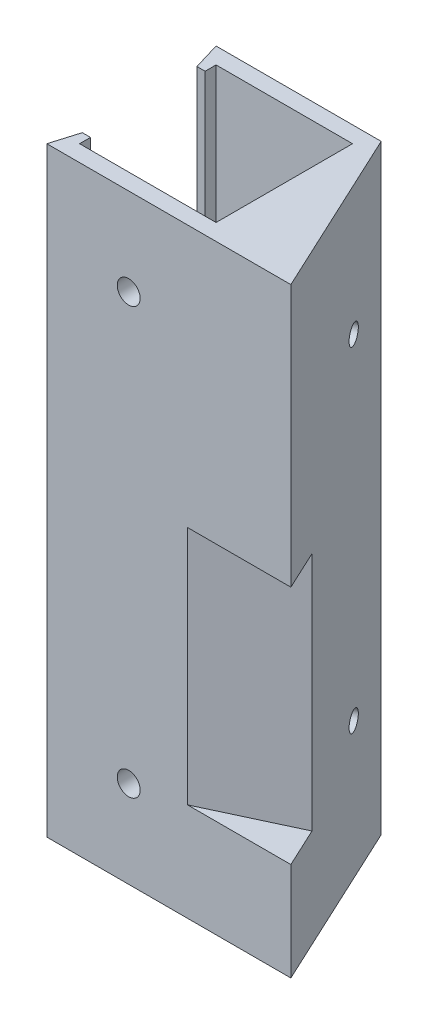
ISO-10303-21;
HEADER;
FILE_DESCRIPTION(('STEP AP214'),'2;1');
FILE_NAME('part.step','',(''),(''),'','','');
FILE_SCHEMA(('AUTOMOTIVE_DESIGN { 1 0 10303 214 1 1 1 1 }'));
ENDSEC;
DATA;
#1=APPLICATION_CONTEXT('core data for automotive mechanical design processes');
#2=APPLICATION_PROTOCOL_DEFINITION('international standard','automotive_design',2000,#1);
#3=PRODUCT_CONTEXT('',#1,'mechanical');
#4=PRODUCT('Part','Part','',(#3));
#5=PRODUCT_RELATED_PRODUCT_CATEGORY('part','',(#4));
#6=PRODUCT_DEFINITION_FORMATION('','',#4);
#7=PRODUCT_DEFINITION_CONTEXT('part definition',#1,'design');
#8=PRODUCT_DEFINITION('design','',#6,#7);
#9=PRODUCT_DEFINITION_SHAPE('','',#8);
#10=(LENGTH_UNIT() NAMED_UNIT(*) SI_UNIT(.MILLI.,.METRE.));
#11=(NAMED_UNIT(*) PLANE_ANGLE_UNIT() SI_UNIT($,.RADIAN.));
#12=(NAMED_UNIT(*) SI_UNIT($,.STERADIAN.) SOLID_ANGLE_UNIT());
#13=UNCERTAINTY_MEASURE_WITH_UNIT(LENGTH_MEASURE(1.E-05),#10,'distance_accuracy_value','');
#14=(GEOMETRIC_REPRESENTATION_CONTEXT(3) GLOBAL_UNCERTAINTY_ASSIGNED_CONTEXT((#13)) GLOBAL_UNIT_ASSIGNED_CONTEXT((#10,
#11,#12)) REPRESENTATION_CONTEXT('',''));
#15=CARTESIAN_POINT('',(0.,0.,0.));
#16=DIRECTION('',(0.,0.,1.));
#17=DIRECTION('',(1.,0.,0.));
#18=AXIS2_PLACEMENT_3D('',#15,#16,#17);
#19=CARTESIAN_POINT('',(-36.5790075050805,110.,-34.9697397940122));
#20=DIRECTION('',(0.,0.,1.));
#21=DIRECTION('',(1.,0.,0.));
#22=AXIS2_PLACEMENT_3D('',#19,#20,#21);
#23=PLANE('',#22);
#24=CARTESIAN_POINT('',(-51.8257575757576,94.,-34.9697397940122));
#25=DIRECTION('',(0.,0.,1.));
#26=DIRECTION('',(1.,0.,0.));
#27=AXIS2_PLACEMENT_3D('',#24,#25,#26);
#28=CIRCLE('',#27,2.1);
#29=CARTESIAN_POINT('',(-49.7257575757576,94.,-34.9697397940122));
#30=VERTEX_POINT('',#29);
#31=EDGE_CURVE('E470',#30,#30,#28,.T.);
#32=ORIENTED_EDGE('',*,*,#31,.T.);
#33=EDGE_LOOP('',(#32));
#34=FACE_BOUND('',#33,.T.);
#35=CARTESIAN_POINT('',(-51.8257575757576,16.,-34.9697397940122));
#36=DIRECTION('',(0.,0.,1.));
#37=DIRECTION('',(1.,0.,0.));
#38=AXIS2_PLACEMENT_3D('',#35,#36,#37);
#39=CIRCLE('',#38,2.1);
#40=CARTESIAN_POINT('',(-49.7257575757576,16.,-34.9697397940122));
#41=VERTEX_POINT('',#40);
#42=EDGE_CURVE('E474',#41,#41,#39,.T.);
#43=ORIENTED_EDGE('',*,*,#42,.T.);
#44=EDGE_LOOP('',(#43));
#45=FACE_BOUND('',#44,.T.);
#46=DIRECTION('',(-1.,0.,0.));
#47=VECTOR('',#46,1.);
#48=CARTESIAN_POINT('',(-36.5790075050805,0.,-34.9697397940122));
#49=LINE('',#48,#47);
#50=CARTESIAN_POINT('',(-36.5790075050805,0.,-34.9697397940122));
#51=VERTEX_POINT('',#50);
#52=CARTESIAN_POINT('',(-66.8257575757576,0.,-34.9697397940122));
#53=VERTEX_POINT('',#52);
#54=EDGE_CURVE('E329',#51,#53,#49,.T.);
#55=ORIENTED_EDGE('',*,*,#54,.T.);
#56=DIRECTION('',(0.,-1.,0.));
#57=VECTOR('',#56,1.);
#58=CARTESIAN_POINT('',(-66.8257575757576,110.,-34.9697397940122));
#59=LINE('',#58,#57);
#60=CARTESIAN_POINT('',(-66.8257575757576,110.,-34.9697397940122));
#61=VERTEX_POINT('',#60);
#62=EDGE_CURVE('E402',#61,#53,#59,.T.);
#63=ORIENTED_EDGE('',*,*,#62,.F.);
#64=DIRECTION('',(-1.,0.,0.));
#65=VECTOR('',#64,1.);
#66=CARTESIAN_POINT('',(-36.5790075050805,110.,-34.9697397940122));
#67=LINE('',#66,#65);
#68=CARTESIAN_POINT('',(-36.5790075050805,110.,-34.9697397940122));
#69=VERTEX_POINT('',#68);
#70=EDGE_CURVE('E330',#69,#61,#67,.T.);
#71=ORIENTED_EDGE('',*,*,#70,.F.);
#72=DIRECTION('',(0.,-1.,0.));
#73=VECTOR('',#72,1.);
#74=CARTESIAN_POINT('',(-36.5790075050805,110.,-34.9697397940122));
#75=LINE('',#74,#73);
#76=EDGE_CURVE('E353',#69,#51,#75,.T.);
#77=ORIENTED_EDGE('',*,*,#76,.T.);
#78=EDGE_LOOP('',(#55,#63,#71,#77));
#79=FACE_BOUND('',#78,.T.);
#80=ADVANCED_FACE('F35',(#34,#45,#79),#23,.F.);
#81=CARTESIAN_POINT('',(-66.8257575757576,110.,-29.9697397940122));
#82=DIRECTION('',(0.,0.,-1.));
#83=DIRECTION('',(-1.,0.,0.));
#84=AXIS2_PLACEMENT_3D('',#81,#82,#83);
#85=PLANE('',#84);
#86=DIRECTION('',(1.,0.,0.));
#87=VECTOR('',#86,1.);
#88=CARTESIAN_POINT('',(-66.8257575757576,110.,-29.9697397940122));
#89=LINE('',#88,#87);
#90=CARTESIAN_POINT('',(-65.3257575757576,110.,-29.9697397940122));
#91=VERTEX_POINT('',#90);
#92=CARTESIAN_POINT('',(-63.8257575757576,110.,-29.9697397940122));
#93=VERTEX_POINT('',#92);
#94=EDGE_CURVE('E333',#91,#93,#89,.T.);
#95=ORIENTED_EDGE('',*,*,#94,.F.);
#96=DIRECTION('',(0.,-1.,0.));
#97=VECTOR('',#96,1.);
#98=CARTESIAN_POINT('',(-65.3257575757576,110.,-29.9697397940122));
#99=LINE('',#98,#97);
#100=CARTESIAN_POINT('',(-65.3257575757576,0.,-29.9697397940122));
#101=VERTEX_POINT('',#100);
#102=EDGE_CURVE('E300',#91,#101,#99,.T.);
#103=ORIENTED_EDGE('',*,*,#102,.T.);
#104=DIRECTION('',(1.,0.,0.));
#105=VECTOR('',#104,1.);
#106=CARTESIAN_POINT('',(-66.8257575757576,0.,-29.9697397940122));
#107=LINE('',#106,#105);
#108=CARTESIAN_POINT('',(-63.8257575757576,0.,-29.9697397940122));
#109=VERTEX_POINT('',#108);
#110=EDGE_CURVE('E356',#101,#109,#107,.T.);
#111=ORIENTED_EDGE('',*,*,#110,.T.);
#112=DIRECTION('',(0.,-1.,0.));
#113=VECTOR('',#112,1.);
#114=CARTESIAN_POINT('',(-63.8257575757576,110.,-29.9697397940122));
#115=LINE('',#114,#113);
#116=EDGE_CURVE('E399',#93,#109,#115,.T.);
#117=ORIENTED_EDGE('',*,*,#116,.F.);
#118=EDGE_LOOP('',(#95,#103,#111,#117));
#119=FACE_BOUND('',#118,.T.);
#120=ADVANCED_FACE('F460',(#119),#85,.F.);
#121=CARTESIAN_POINT('',(-63.8257575757576,110.,-29.9697397940122));
#122=DIRECTION('',(-1.,0.,0.));
#123=DIRECTION('',(0.,0.,1.));
#124=AXIS2_PLACEMENT_3D('',#121,#122,#123);
#125=PLANE('',#124);
#126=DIRECTION('',(0.,0.,-1.));
#127=VECTOR('',#126,1.);
#128=CARTESIAN_POINT('',(-63.8257575757576,0.,-29.9697397940122));
#129=LINE('',#128,#127);
#130=CARTESIAN_POINT('',(-63.8257575757576,0.,-31.9697397940122));
#131=VERTEX_POINT('',#130);
#132=EDGE_CURVE('E358',#109,#131,#129,.T.);
#133=ORIENTED_EDGE('',*,*,#132,.T.);
#134=DIRECTION('',(0.,-1.,0.));
#135=VECTOR('',#134,1.);
#136=CARTESIAN_POINT('',(-63.8257575757576,110.,-31.9697397940122));
#137=LINE('',#136,#135);
#138=CARTESIAN_POINT('',(-63.8257575757576,110.,-31.9697397940122));
#139=VERTEX_POINT('',#138);
#140=EDGE_CURVE('E396',#139,#131,#137,.T.);
#141=ORIENTED_EDGE('',*,*,#140,.F.);
#142=DIRECTION('',(0.,0.,-1.));
#143=VECTOR('',#142,1.);
#144=CARTESIAN_POINT('',(-63.8257575757576,110.,-29.9697397940122));
#145=LINE('',#144,#143);
#146=EDGE_CURVE('E336',#93,#139,#145,.T.);
#147=ORIENTED_EDGE('',*,*,#146,.F.);
#148=ORIENTED_EDGE('',*,*,#116,.T.);
#149=EDGE_LOOP('',(#133,#141,#147,#148));
#150=FACE_BOUND('',#149,.T.);
#151=ADVANCED_FACE('F465',(#150),#125,.F.);
#152=CARTESIAN_POINT('',(-63.8257575757576,110.,-31.9697397940122));
#153=DIRECTION('',(0.,0.,-1.));
#154=DIRECTION('',(-1.,0.,0.));
#155=AXIS2_PLACEMENT_3D('',#152,#153,#154);
#156=PLANE('',#155);
#157=CARTESIAN_POINT('',(-51.8257575757576,94.,-31.9697397940122));
#158=DIRECTION('',(0.,0.,-1.));
#159=DIRECTION('',(-1.,0.,0.));
#160=AXIS2_PLACEMENT_3D('',#157,#158,#159);
#161=CIRCLE('',#160,2.1);
#162=CARTESIAN_POINT('',(-53.9257575757576,94.,-31.9697397940122));
#163=VERTEX_POINT('',#162);
#164=EDGE_CURVE('E241',#163,#163,#161,.T.);
#165=ORIENTED_EDGE('',*,*,#164,.T.);
#166=EDGE_LOOP('',(#165));
#167=FACE_BOUND('',#166,.T.);
#168=CARTESIAN_POINT('',(-51.8257575757576,16.,-31.9697397940122));
#169=DIRECTION('',(0.,0.,-1.));
#170=DIRECTION('',(-1.,0.,0.));
#171=AXIS2_PLACEMENT_3D('',#168,#169,#170);
#172=CIRCLE('',#171,2.1);
#173=CARTESIAN_POINT('',(-53.9257575757576,16.,-31.9697397940122));
#174=VERTEX_POINT('',#173);
#175=EDGE_CURVE('E647',#174,#174,#172,.T.);
#176=ORIENTED_EDGE('',*,*,#175,.T.);
#177=EDGE_LOOP('',(#176));
#178=FACE_BOUND('',#177,.T.);
#179=DIRECTION('',(1.,0.,0.));
#180=VECTOR('',#179,1.);
#181=CARTESIAN_POINT('',(-63.8257575757576,0.,-31.9697397940122));
#182=LINE('',#181,#180);
#183=CARTESIAN_POINT('',(-38.8257575757576,0.,-31.9697397940122));
#184=VERTEX_POINT('',#183);
#185=EDGE_CURVE('E360',#131,#184,#182,.T.);
#186=ORIENTED_EDGE('',*,*,#185,.T.);
#187=DIRECTION('',(0.,-1.,0.));
#188=VECTOR('',#187,1.);
#189=CARTESIAN_POINT('',(-38.8257575757576,110.,-31.9697397940122));
#190=LINE('',#189,#188);
#191=CARTESIAN_POINT('',(-38.8257575757576,110.,-31.9697397940122));
#192=VERTEX_POINT('',#191);
#193=EDGE_CURVE('E393',#192,#184,#190,.T.);
#194=ORIENTED_EDGE('',*,*,#193,.F.);
#195=DIRECTION('',(1.,0.,0.));
#196=VECTOR('',#195,1.);
#197=CARTESIAN_POINT('',(-63.8257575757576,110.,-31.9697397940122));
#198=LINE('',#197,#196);
#199=EDGE_CURVE('E338',#139,#192,#198,.T.);
#200=ORIENTED_EDGE('',*,*,#199,.F.);
#201=ORIENTED_EDGE('',*,*,#140,.T.);
#202=EDGE_LOOP('',(#186,#194,#200,#201));
#203=FACE_BOUND('',#202,.T.);
#204=ADVANCED_FACE('F529',(#167,#178,#203),#156,.F.);
#205=CARTESIAN_POINT('',(-38.8257575757576,110.,-31.9697397940122));
#206=DIRECTION('',(1.,0.,0.));
#207=DIRECTION('',(0.,0.,-1.));
#208=AXIS2_PLACEMENT_3D('',#205,#206,#207);
#209=PLANE('',#208);
#210=DIRECTION('',(0.,0.,-1.));
#211=VECTOR('',#210,1.);
#212=CARTESIAN_POINT('',(-38.8257575757576,82.8,-31.9697397940122));
#213=LINE('',#212,#211);
#214=CARTESIAN_POINT('',(-38.8257575757576,82.8,-20.2121053228705));
#215=VERTEX_POINT('',#214);
#216=CARTESIAN_POINT('',(-38.8257575757576,82.8,-24.6713540925867));
#217=VERTEX_POINT('',#216);
#218=EDGE_CURVE('E42',#215,#217,#213,.T.);
#219=ORIENTED_EDGE('',*,*,#218,.T.);
#220=DIRECTION('',(0.,0.84340471613653,-0.53727877754352));
#221=VECTOR('',#220,1.);
#222=CARTESIAN_POINT('',(-38.8257575757576,105.455432925123,-39.1036700066929));
#223=LINE('',#222,#221);
#224=CARTESIAN_POINT('',(-38.8257575757576,86.3,-26.9009784774448));
#225=VERTEX_POINT('',#224);
#226=EDGE_CURVE('E11',#217,#225,#223,.T.);
#227=ORIENTED_EDGE('',*,*,#226,.T.);
#228=DIRECTION('',(0.,0.84340471613653,0.53727877754352));
#229=VECTOR('',#228,1.);
#230=CARTESIAN_POINT('',(-38.8257575757576,100.86168089542,-17.6246702463159));
#231=LINE('',#230,#229);
#232=CARTESIAN_POINT('',(-38.8257575757576,89.8,-24.6713540925867));
#233=VERTEX_POINT('',#232);
#234=EDGE_CURVE('E216',#225,#233,#231,.T.);
#235=ORIENTED_EDGE('',*,*,#234,.T.);
#236=DIRECTION('',(0.,0.,1.));
#237=VECTOR('',#236,1.);
#238=CARTESIAN_POINT('',(-38.8257575757576,89.8,-31.9697397940122));
#239=LINE('',#238,#237);
#240=CARTESIAN_POINT('',(-38.8257575757576,89.8,-20.2121053228706));
#241=VERTEX_POINT('',#240);
#242=EDGE_CURVE('E427',#233,#241,#239,.T.);
#243=ORIENTED_EDGE('',*,*,#242,.T.);
#244=DIRECTION('',(0.,-0.84340471613653,0.53727877754352));
#245=VECTOR('',#244,1.);
#246=CARTESIAN_POINT('',(-38.8257575757576,109.496791712304,-32.759661638649));
#247=LINE('',#246,#245);
#248=CARTESIAN_POINT('',(-38.8257575757576,86.3,-17.9824809380125));
#249=VERTEX_POINT('',#248);
#250=EDGE_CURVE('E430',#241,#249,#247,.T.);
#251=ORIENTED_EDGE('',*,*,#250,.T.);
#252=DIRECTION('',(0.,-0.843404716136531,-0.537278777543519));
#253=VECTOR('',#252,1.);
#254=CARTESIAN_POINT('',(-38.8257575757576,96.8203221082391,-11.280661878272));
#255=LINE('',#254,#253);
#256=EDGE_CURVE('E433',#249,#215,#255,.T.);
#257=ORIENTED_EDGE('',*,*,#256,.T.);
#258=EDGE_LOOP('',(#219,#227,#235,#243,#251,#257));
#259=FACE_BOUND('',#258,.T.);
#260=DIRECTION('',(0.,0.,-1.));
#261=VECTOR('',#260,1.);
#262=CARTESIAN_POINT('',(-38.8257575757576,21.5000000000001,-31.9697397940131));
#263=LINE('',#262,#261);
#264=CARTESIAN_POINT('',(-38.8257575757576,21.5,-20.2121053228706));
#265=VERTEX_POINT('',#264);
#266=CARTESIAN_POINT('',(-38.8257575757576,21.5,-24.6713540925868));
#267=VERTEX_POINT('',#266);
#268=EDGE_CURVE('E420',#265,#267,#263,.T.);
#269=ORIENTED_EDGE('',*,*,#268,.T.);
#270=DIRECTION('',(0.,0.843404716136534,-0.537278777543514));
#271=VECTOR('',#270,1.);
#272=CARTESIAN_POINT('',(-38.8257575757576,87.7600548069659,-66.8813637896274));
#273=LINE('',#272,#271);
#274=CARTESIAN_POINT('',(-38.8257575757576,25.,-26.9009784774448));
#275=VERTEX_POINT('',#274);
#276=EDGE_CURVE('E423',#267,#275,#273,.T.);
#277=ORIENTED_EDGE('',*,*,#276,.T.);
#278=DIRECTION('',(0.,0.84340471613653,0.53727877754352));
#279=VECTOR('',#278,1.);
#280=CARTESIAN_POINT('',(-38.8257575757576,83.1663027772625,10.1530235366189));
#281=LINE('',#280,#279);
#282=CARTESIAN_POINT('',(-38.8257575757576,28.5,-24.6713540925867));
#283=VERTEX_POINT('',#282);
#284=EDGE_CURVE('E404',#275,#283,#281,.T.);
#285=ORIENTED_EDGE('',*,*,#284,.T.);
#286=DIRECTION('',(0.,0.,1.));
#287=VECTOR('',#286,1.);
#288=CARTESIAN_POINT('',(-38.8257575757576,28.5,-31.9697397940124));
#289=LINE('',#288,#287);
#290=CARTESIAN_POINT('',(-38.8257575757576,28.5,-20.2121053228705));
#291=VERTEX_POINT('',#290);
#292=EDGE_CURVE('E411',#283,#291,#289,.T.);
#293=ORIENTED_EDGE('',*,*,#292,.T.);
#294=DIRECTION('',(0.,-0.843404716136533,0.537278777543514));
#295=VECTOR('',#294,1.);
#296=CARTESIAN_POINT('',(-38.8257575757576,91.8014135941471,-60.5373554215836));
#297=LINE('',#296,#295);
#298=CARTESIAN_POINT('',(-38.8257575757576,25.,-17.9824809380125));
#299=VERTEX_POINT('',#298);
#300=EDGE_CURVE('E414',#291,#299,#297,.T.);
#301=ORIENTED_EDGE('',*,*,#300,.T.);
#302=DIRECTION('',(0.,-0.843404716136525,-0.537278777543528));
#303=VECTOR('',#302,1.);
#304=CARTESIAN_POINT('',(-38.8257575757576,79.1249439900805,16.497031904663));
#305=LINE('',#304,#303);
#306=EDGE_CURVE('E417',#299,#265,#305,.T.);
#307=ORIENTED_EDGE('',*,*,#306,.T.);
#308=EDGE_LOOP('',(#269,#277,#285,#293,#301,#307));
#309=FACE_BOUND('',#308,.T.);
#310=DIRECTION('',(0.,0.,1.));
#311=VECTOR('',#310,1.);
#312=CARTESIAN_POINT('',(-38.8257575757576,0.,-31.9697397940122));
#313=LINE('',#312,#311);
#314=CARTESIAN_POINT('',(-38.8257575757576,0.,-6.96973979401218));
#315=VERTEX_POINT('',#314);
#316=EDGE_CURVE('E362',#184,#315,#313,.T.);
#317=ORIENTED_EDGE('',*,*,#316,.T.);
#318=DIRECTION('',(0.,-1.,0.));
#319=VECTOR('',#318,1.);
#320=CARTESIAN_POINT('',(-38.8257575757576,110.,-6.96973979401218));
#321=LINE('',#320,#319);
#322=CARTESIAN_POINT('',(-38.8257575757576,110.,-6.96973979401218));
#323=VERTEX_POINT('',#322);
#324=EDGE_CURVE('E390',#323,#315,#321,.T.);
#325=ORIENTED_EDGE('',*,*,#324,.F.);
#326=DIRECTION('',(0.,0.,1.));
#327=VECTOR('',#326,1.);
#328=CARTESIAN_POINT('',(-38.8257575757576,110.,-31.9697397940122));
#329=LINE('',#328,#327);
#330=EDGE_CURVE('E340',#192,#323,#329,.T.);
#331=ORIENTED_EDGE('',*,*,#330,.F.);
#332=ORIENTED_EDGE('',*,*,#193,.T.);
#333=EDGE_LOOP('',(#317,#325,#331,#332));
#334=FACE_BOUND('',#333,.T.);
#335=ADVANCED_FACE('F437',(#259,#309,#334),#209,.F.);
#336=CARTESIAN_POINT('',(-38.8257575757576,110.,-6.96973979401218));
#337=DIRECTION('',(0.,0.,1.));
#338=DIRECTION('',(1.,0.,0.));
#339=AXIS2_PLACEMENT_3D('',#336,#337,#338);
#340=PLANE('',#339);
#341=CARTESIAN_POINT('',(-51.8257575757576,94.,-6.96973979401218));
#342=DIRECTION('',(0.,0.,1.));
#343=DIRECTION('',(1.,0.,0.));
#344=AXIS2_PLACEMENT_3D('',#341,#342,#343);
#345=CIRCLE('',#344,2.1);
#346=CARTESIAN_POINT('',(-49.7257575757576,94.,-6.96973979401218));
#347=VERTEX_POINT('',#346);
#348=EDGE_CURVE('E646',#347,#347,#345,.T.);
#349=ORIENTED_EDGE('',*,*,#348,.T.);
#350=EDGE_LOOP('',(#349));
#351=FACE_BOUND('',#350,.T.);
#352=CARTESIAN_POINT('',(-51.8257575757576,16.,-6.96973979401218));
#353=DIRECTION('',(0.,0.,1.));
#354=DIRECTION('',(1.,0.,0.));
#355=AXIS2_PLACEMENT_3D('',#352,#353,#354);
#356=CIRCLE('',#355,2.1);
#357=CARTESIAN_POINT('',(-49.7257575757576,16.,-6.96973979401218));
#358=VERTEX_POINT('',#357);
#359=EDGE_CURVE('E650',#358,#358,#356,.T.);
#360=ORIENTED_EDGE('',*,*,#359,.T.);
#361=EDGE_LOOP('',(#360));
#362=FACE_BOUND('',#361,.T.);
#363=DIRECTION('',(-1.,0.,0.));
#364=VECTOR('',#363,1.);
#365=CARTESIAN_POINT('',(-38.8257575757576,0.,-6.96973979401218));
#366=LINE('',#365,#364);
#367=CARTESIAN_POINT('',(-63.8257575757576,0.,-6.96973979401218));
#368=VERTEX_POINT('',#367);
#369=EDGE_CURVE('E364',#315,#368,#366,.T.);
#370=ORIENTED_EDGE('',*,*,#369,.T.);
#371=DIRECTION('',(0.,-1.,0.));
#372=VECTOR('',#371,1.);
#373=CARTESIAN_POINT('',(-63.8257575757576,110.,-6.96973979401218));
#374=LINE('',#373,#372);
#375=CARTESIAN_POINT('',(-63.8257575757576,110.,-6.96973979401218));
#376=VERTEX_POINT('',#375);
#377=EDGE_CURVE('E387',#376,#368,#374,.T.);
#378=ORIENTED_EDGE('',*,*,#377,.F.);
#379=DIRECTION('',(-1.,0.,0.));
#380=VECTOR('',#379,1.);
#381=CARTESIAN_POINT('',(-38.8257575757576,110.,-6.96973979401218));
#382=LINE('',#381,#380);
#383=EDGE_CURVE('E342',#323,#376,#382,.T.);
#384=ORIENTED_EDGE('',*,*,#383,.F.);
#385=ORIENTED_EDGE('',*,*,#324,.T.);
#386=EDGE_LOOP('',(#370,#378,#384,#385));
#387=FACE_BOUND('',#386,.T.);
#388=ADVANCED_FACE('F521',(#351,#362,#387),#340,.F.);
#389=CARTESIAN_POINT('',(-63.8257575757576,110.,-6.96973979401218));
#390=DIRECTION('',(-1.,0.,0.));
#391=DIRECTION('',(0.,0.,1.));
#392=AXIS2_PLACEMENT_3D('',#389,#390,#391);
#393=PLANE('',#392);
#394=DIRECTION('',(0.,0.,-1.));
#395=VECTOR('',#394,1.);
#396=CARTESIAN_POINT('',(-63.8257575757576,0.,-6.96973979401218));
#397=LINE('',#396,#395);
#398=CARTESIAN_POINT('',(-63.8257575757576,0.,-8.96973979401218));
#399=VERTEX_POINT('',#398);
#400=EDGE_CURVE('E366',#368,#399,#397,.T.);
#401=ORIENTED_EDGE('',*,*,#400,.T.);
#402=DIRECTION('',(0.,-1.,0.));
#403=VECTOR('',#402,1.);
#404=CARTESIAN_POINT('',(-63.8257575757576,110.,-8.96973979401218));
#405=LINE('',#404,#403);
#406=CARTESIAN_POINT('',(-63.8257575757576,110.,-8.96973979401218));
#407=VERTEX_POINT('',#406);
#408=EDGE_CURVE('E384',#407,#399,#405,.T.);
#409=ORIENTED_EDGE('',*,*,#408,.F.);
#410=DIRECTION('',(0.,0.,-1.));
#411=VECTOR('',#410,1.);
#412=CARTESIAN_POINT('',(-63.8257575757576,110.,-6.96973979401218));
#413=LINE('',#412,#411);
#414=EDGE_CURVE('E344',#376,#407,#413,.T.);
#415=ORIENTED_EDGE('',*,*,#414,.F.);
#416=ORIENTED_EDGE('',*,*,#377,.T.);
#417=EDGE_LOOP('',(#401,#409,#415,#416));
#418=FACE_BOUND('',#417,.T.);
#419=ADVANCED_FACE('F515',(#418),#393,.F.);
#420=CARTESIAN_POINT('',(-63.8257575757576,110.,-8.96973979401218));
#421=DIRECTION('',(0.,0.,1.));
#422=DIRECTION('',(1.,0.,0.));
#423=AXIS2_PLACEMENT_3D('',#420,#421,#422);
#424=PLANE('',#423);
#425=DIRECTION('',(-1.,0.,0.));
#426=VECTOR('',#425,1.);
#427=CARTESIAN_POINT('',(-63.8257575757576,0.,-8.96973979401218));
#428=LINE('',#427,#426);
#429=CARTESIAN_POINT('',(-65.3257575757576,0.,-8.96973979401218));
#430=VERTEX_POINT('',#429);
#431=EDGE_CURVE('E368',#399,#430,#428,.T.);
#432=ORIENTED_EDGE('',*,*,#431,.T.);
#433=DIRECTION('',(0.,-1.,0.));
#434=VECTOR('',#433,1.);
#435=CARTESIAN_POINT('',(-65.3257575757576,110.,-8.96973979401218));
#436=LINE('',#435,#434);
#437=CARTESIAN_POINT('',(-65.3257575757576,110.,-8.96973979401218));
#438=VERTEX_POINT('',#437);
#439=EDGE_CURVE('E297',#438,#430,#436,.T.);
#440=ORIENTED_EDGE('',*,*,#439,.F.);
#441=DIRECTION('',(-1.,0.,0.));
#442=VECTOR('',#441,1.);
#443=CARTESIAN_POINT('',(-63.8257575757576,110.,-8.96973979401218));
#444=LINE('',#443,#442);
#445=EDGE_CURVE('E346',#407,#438,#444,.T.);
#446=ORIENTED_EDGE('',*,*,#445,.F.);
#447=ORIENTED_EDGE('',*,*,#408,.T.);
#448=EDGE_LOOP('',(#432,#440,#446,#447));
#449=FACE_BOUND('',#448,.T.);
#450=ADVANCED_FACE('F510',(#449),#424,.F.);
#451=CARTESIAN_POINT('',(-66.8257575757576,110.,-3.96973979401218));
#452=DIRECTION('',(0.,0.,-1.));
#453=DIRECTION('',(-1.,0.,0.));
#454=AXIS2_PLACEMENT_3D('',#451,#452,#453);
#455=PLANE('',#454);
#456=CARTESIAN_POINT('',(-51.8257575757576,94.,-3.96973979401218));
#457=DIRECTION('',(0.,0.,1.));
#458=DIRECTION('',(1.,0.,0.));
#459=AXIS2_PLACEMENT_3D('',#456,#457,#458);
#460=CIRCLE('',#459,2.1);
#461=CARTESIAN_POINT('',(-49.7257575757576,94.,-3.96973979401218));
#462=VERTEX_POINT('',#461);
#463=EDGE_CURVE('E643',#462,#462,#460,.T.);
#464=ORIENTED_EDGE('',*,*,#463,.F.);
#465=EDGE_LOOP('',(#464));
#466=FACE_BOUND('',#465,.T.);
#467=CARTESIAN_POINT('',(-51.8257575757576,16.,-3.96973979401218));
#468=DIRECTION('',(0.,0.,1.));
#469=DIRECTION('',(1.,0.,0.));
#470=AXIS2_PLACEMENT_3D('',#467,#468,#469);
#471=CIRCLE('',#470,2.1);
#472=CARTESIAN_POINT('',(-49.7257575757576,16.,-3.96973979401218));
#473=VERTEX_POINT('',#472);
#474=EDGE_CURVE('E655',#473,#473,#471,.T.);
#475=ORIENTED_EDGE('',*,*,#474,.F.);
#476=EDGE_LOOP('',(#475));
#477=FACE_BOUND('',#476,.T.);
#478=DIRECTION('',(0.,1.,0.));
#479=VECTOR('',#478,1.);
#480=CARTESIAN_POINT('',(-41.053082767496,110.,-3.96973979401218));
#481=LINE('',#480,#479);
#482=CARTESIAN_POINT('',(-41.053082767496,18.,-3.96973979401218));
#483=VERTEX_POINT('',#482);
#484=CARTESIAN_POINT('',(-41.053082767496,62.,-3.96973979401217));
#485=VERTEX_POINT('',#484);
#486=EDGE_CURVE('E323',#483,#485,#481,.T.);
#487=ORIENTED_EDGE('',*,*,#486,.T.);
#488=DIRECTION('',(1.,0.,0.));
#489=VECTOR('',#488,1.);
#490=CARTESIAN_POINT('',(-66.8257575757576,62.,-3.96973979401218));
#491=LINE('',#490,#489);
#492=CARTESIAN_POINT('',(-22.1234701022758,62.,-3.96973979401217));
#493=VERTEX_POINT('',#492);
#494=EDGE_CURVE('E326',#485,#493,#491,.T.);
#495=ORIENTED_EDGE('',*,*,#494,.T.);
#496=DIRECTION('',(0.,-1.,0.));
#497=VECTOR('',#496,1.);
#498=CARTESIAN_POINT('',(-22.1234701022757,110.,-3.96973979401218));
#499=LINE('',#498,#497);
#500=CARTESIAN_POINT('',(-22.1234701022757,110.,-3.96973979401218));
#501=VERTEX_POINT('',#500);
#502=EDGE_CURVE('E378',#501,#493,#499,.T.);
#503=ORIENTED_EDGE('',*,*,#502,.F.);
#504=DIRECTION('',(1.,0.,0.));
#505=VECTOR('',#504,1.);
#506=CARTESIAN_POINT('',(-66.8257575757576,110.,-3.96973979401218));
#507=LINE('',#506,#505);
#508=CARTESIAN_POINT('',(-66.8257575757576,110.,-3.96973979401218));
#509=VERTEX_POINT('',#508);
#510=EDGE_CURVE('E349',#509,#501,#507,.T.);
#511=ORIENTED_EDGE('',*,*,#510,.F.);
#512=DIRECTION('',(0.,-1.,0.));
#513=VECTOR('',#512,1.);
#514=CARTESIAN_POINT('',(-66.8257575757576,110.,-3.96973979401218));
#515=LINE('',#514,#513);
#516=CARTESIAN_POINT('',(-66.8257575757576,0.,-3.96973979401218));
#517=VERTEX_POINT('',#516);
#518=EDGE_CURVE('E381',#509,#517,#515,.T.);
#519=ORIENTED_EDGE('',*,*,#518,.T.);
#520=DIRECTION('',(1.,0.,0.));
#521=VECTOR('',#520,1.);
#522=CARTESIAN_POINT('',(-66.8257575757576,0.,-3.96973979401218));
#523=LINE('',#522,#521);
#524=CARTESIAN_POINT('',(-22.1234701022757,0.,-3.96973979401218));
#525=VERTEX_POINT('',#524);
#526=EDGE_CURVE('E371',#517,#525,#523,.T.);
#527=ORIENTED_EDGE('',*,*,#526,.T.);
#528=CARTESIAN_POINT('',(-22.1234701022757,18.,-3.96973979401218));
#529=VERTEX_POINT('',#528);
#530=EDGE_CURVE('E377',#529,#525,#499,.T.);
#531=ORIENTED_EDGE('',*,*,#530,.F.);
#532=DIRECTION('',(-1.,0.,0.));
#533=VECTOR('',#532,1.);
#534=CARTESIAN_POINT('',(-66.8257575757576,18.,-3.96973979401218));
#535=LINE('',#534,#533);
#536=EDGE_CURVE('E319',#529,#483,#535,.T.);
#537=ORIENTED_EDGE('',*,*,#536,.T.);
#538=EDGE_LOOP('',(#487,#495,#503,#511,#519,#527,#531,#537));
#539=FACE_BOUND('',#538,.T.);
#540=ADVANCED_FACE('F503',(#466,#477,#539),#455,.F.);
#541=CARTESIAN_POINT('',(-22.1234701022757,110.,-3.96973979401218));
#542=DIRECTION('',(-0.906307787036652,0.,0.422618261740694));
#543=DIRECTION('',(0.422618261740694,0.,0.906307787036653));
#544=AXIS2_PLACEMENT_3D('',#541,#542,#543);
#545=PLANE('',#544);
#546=CARTESIAN_POINT('',(-32.1817847317043,86.3,-25.5398651254845));
#547=DIRECTION('',(0.906307787036653,0.,-0.422618261740694));
#548=DIRECTION('',(-0.422618261740694,0.,-0.906307787036653));
#549=AXIS2_PLACEMENT_3D('',#546,#547,#548);
#550=CIRCLE('',#549,1.75);
#551=CARTESIAN_POINT('',(-32.9213666897505,86.3,-27.1259037527986));
#552=VERTEX_POINT('',#551);
#553=EDGE_CURVE('E286',#552,#552,#550,.T.);
#554=ORIENTED_EDGE('',*,*,#553,.F.);
#555=EDGE_LOOP('',(#554));
#556=FACE_BOUND('',#555,.T.);
#557=CARTESIAN_POINT('',(-32.1817847317043,25.,-25.5398651254845));
#558=DIRECTION('',(0.906307787036653,0.,-0.422618261740694));
#559=DIRECTION('',(-0.422618261740694,0.,-0.906307787036653));
#560=AXIS2_PLACEMENT_3D('',#557,#558,#559);
#561=CIRCLE('',#560,1.75);
#562=CARTESIAN_POINT('',(-32.9213666897505,25.,-27.1259037527987));
#563=VERTEX_POINT('',#562);
#564=EDGE_CURVE('E290',#563,#563,#561,.T.);
#565=ORIENTED_EDGE('',*,*,#564,.F.);
#566=EDGE_LOOP('',(#565));
#567=FACE_BOUND('',#566,.T.);
#568=ORIENTED_EDGE('',*,*,#502,.T.);
#569=DIRECTION('',(0.422618261740694,0.,0.906307787036652));
#570=VECTOR('',#569,1.);
#571=CARTESIAN_POINT('',(-22.1234701022758,62.,-3.96973979401217));
#572=LINE('',#571,#570);
#573=CARTESIAN_POINT('',(-25.5044161962013,62.,-11.2202020903054));
#574=VERTEX_POINT('',#573);
#575=EDGE_CURVE('E314',#574,#493,#572,.T.);
#576=ORIENTED_EDGE('',*,*,#575,.F.);
#577=DIRECTION('',(0.,1.,0.));
#578=VECTOR('',#577,1.);
#579=CARTESIAN_POINT('',(-25.5044161962013,62.,-11.2202020903054));
#580=LINE('',#579,#578);
#581=CARTESIAN_POINT('',(-25.5044161962013,18.,-11.2202020903054));
#582=VERTEX_POINT('',#581);
#583=EDGE_CURVE('E311',#582,#574,#580,.T.);
#584=ORIENTED_EDGE('',*,*,#583,.F.);
#585=DIRECTION('',(-0.422618261740694,0.,-0.906307787036653));
#586=VECTOR('',#585,1.);
#587=CARTESIAN_POINT('',(-22.1234701022758,18.,-3.96973979401218));
#588=LINE('',#587,#586);
#589=EDGE_CURVE('E302',#529,#582,#588,.T.);
#590=ORIENTED_EDGE('',*,*,#589,.F.);
#591=ORIENTED_EDGE('',*,*,#530,.T.);
#592=DIRECTION('',(-0.422618261740694,0.,-0.906307787036653));
#593=VECTOR('',#592,1.);
#594=CARTESIAN_POINT('',(-22.1234701022757,0.,-3.96973979401218));
#595=LINE('',#594,#593);
#596=EDGE_CURVE('E334',#525,#51,#595,.T.);
#597=ORIENTED_EDGE('',*,*,#596,.T.);
#598=ORIENTED_EDGE('',*,*,#76,.F.);
#599=DIRECTION('',(-0.422618261740694,0.,-0.906307787036653));
#600=VECTOR('',#599,1.);
#601=CARTESIAN_POINT('',(-22.1234701022757,110.,-3.96973979401218));
#602=LINE('',#601,#600);
#603=EDGE_CURVE('E351',#501,#69,#602,.T.);
#604=ORIENTED_EDGE('',*,*,#603,.F.);
#605=EDGE_LOOP('',(#568,#576,#584,#590,#591,#597,#598,#604));
#606=FACE_BOUND('',#605,.T.);
#607=ADVANCED_FACE('F498',(#556,#567,#606),#545,.F.);
#608=CARTESIAN_POINT('',(0.,110.,0.));
#609=DIRECTION('',(0.,1.,0.));
#610=DIRECTION('',(0.,0.,1.));
#611=AXIS2_PLACEMENT_3D('',#608,#609,#610);
#612=PLANE('',#611);
#613=DIRECTION('',(-0.287347885566346,0.,0.957826285221151));
#614=VECTOR('',#613,1.);
#615=CARTESIAN_POINT('',(-66.8257575757576,110.,-3.96973979401218));
#616=LINE('',#615,#614);
#617=EDGE_CURVE('E294',#438,#509,#616,.T.);
#618=ORIENTED_EDGE('',*,*,#617,.T.);
#619=ORIENTED_EDGE('',*,*,#510,.T.);
#620=ORIENTED_EDGE('',*,*,#603,.T.);
#621=ORIENTED_EDGE('',*,*,#70,.T.);
#622=DIRECTION('',(0.287347885566346,0.,0.957826285221151));
#623=VECTOR('',#622,1.);
#624=CARTESIAN_POINT('',(-66.8257575757576,110.,-34.9697397940122));
#625=LINE('',#624,#623);
#626=EDGE_CURVE('E303',#61,#91,#625,.T.);
#627=ORIENTED_EDGE('',*,*,#626,.T.);
#628=ORIENTED_EDGE('',*,*,#94,.T.);
#629=ORIENTED_EDGE('',*,*,#146,.T.);
#630=ORIENTED_EDGE('',*,*,#199,.T.);
#631=ORIENTED_EDGE('',*,*,#330,.T.);
#632=ORIENTED_EDGE('',*,*,#383,.T.);
#633=ORIENTED_EDGE('',*,*,#414,.T.);
#634=ORIENTED_EDGE('',*,*,#445,.T.);
#635=EDGE_LOOP('',(#618,#619,#620,#621,#627,#628,#629,#630,#631,#632,#633,#634));
#636=FACE_BOUND('',#635,.T.);
#637=ADVANCED_FACE('F492',(#636),#612,.T.);
#638=CARTESIAN_POINT('',(0.,0.,0.));
#639=DIRECTION('',(0.,1.,0.));
#640=DIRECTION('',(0.,0.,1.));
#641=AXIS2_PLACEMENT_3D('',#638,#639,#640);
#642=PLANE('',#641);
#643=ORIENTED_EDGE('',*,*,#526,.F.);
#644=DIRECTION('',(-0.287347885566346,0.,0.957826285221151));
#645=VECTOR('',#644,1.);
#646=CARTESIAN_POINT('',(-66.8257575757576,0.,-3.96973979401218));
#647=LINE('',#646,#645);
#648=EDGE_CURVE('E298',#430,#517,#647,.T.);
#649=ORIENTED_EDGE('',*,*,#648,.F.);
#650=ORIENTED_EDGE('',*,*,#431,.F.);
#651=ORIENTED_EDGE('',*,*,#400,.F.);
#652=ORIENTED_EDGE('',*,*,#369,.F.);
#653=ORIENTED_EDGE('',*,*,#316,.F.);
#654=ORIENTED_EDGE('',*,*,#185,.F.);
#655=ORIENTED_EDGE('',*,*,#132,.F.);
#656=ORIENTED_EDGE('',*,*,#110,.F.);
#657=DIRECTION('',(0.287347885566346,0.,0.957826285221151));
#658=VECTOR('',#657,1.);
#659=CARTESIAN_POINT('',(-66.8257575757576,0.,-34.9697397940122));
#660=LINE('',#659,#658);
#661=EDGE_CURVE('E289',#53,#101,#660,.T.);
#662=ORIENTED_EDGE('',*,*,#661,.F.);
#663=ORIENTED_EDGE('',*,*,#54,.F.);
#664=ORIENTED_EDGE('',*,*,#596,.F.);
#665=EDGE_LOOP('',(#643,#649,#650,#651,#652,#653,#654,#655,#656,#662,#663,#664));
#666=FACE_BOUND('',#665,.T.);
#667=ADVANCED_FACE('F483',(#666),#642,.F.);
#668=CARTESIAN_POINT('',(-121.817326676308,62.,42.5182689974641));
#669=DIRECTION('',(0.,1.,0.));
#670=DIRECTION('',(0.,0.,1.));
#671=AXIS2_PLACEMENT_3D('',#668,#669,#670);
#672=PLANE('',#671);
#673=DIRECTION('',(0.906307787036652,0.,-0.422618261740694));
#674=VECTOR('',#673,1.);
#675=CARTESIAN_POINT('',(-125.198272770233,62.,35.2678067011709));
#676=LINE('',#675,#674);
#677=EDGE_CURVE('E317',#485,#574,#676,.T.);
#678=ORIENTED_EDGE('',*,*,#677,.T.);
#679=ORIENTED_EDGE('',*,*,#575,.T.);
#680=ORIENTED_EDGE('',*,*,#494,.F.);
#681=EDGE_LOOP('',(#678,#679,#680));
#682=FACE_BOUND('',#681,.T.);
#683=ADVANCED_FACE('F556',(#682),#672,.F.);
#684=CARTESIAN_POINT('',(-125.198272770233,62.,35.2678067011709));
#685=DIRECTION('',(-0.422618261740694,0.,-0.906307787036652));
#686=DIRECTION('',(-0.906307787036653,0.,0.422618261740694));
#687=AXIS2_PLACEMENT_3D('',#684,#685,#686);
#688=PLANE('',#687);
#689=DIRECTION('',(0.906307787036652,0.,-0.422618261740694));
#690=VECTOR('',#689,1.);
#691=CARTESIAN_POINT('',(-125.198272770233,18.,35.2678067011709));
#692=LINE('',#691,#690);
#693=EDGE_CURVE('E316',#483,#582,#692,.T.);
#694=ORIENTED_EDGE('',*,*,#693,.T.);
#695=ORIENTED_EDGE('',*,*,#583,.T.);
#696=ORIENTED_EDGE('',*,*,#677,.F.);
#697=ORIENTED_EDGE('',*,*,#486,.F.);
#698=EDGE_LOOP('',(#694,#695,#696,#697));
#699=FACE_BOUND('',#698,.T.);
#700=ADVANCED_FACE('F562',(#699),#688,.F.);
#701=CARTESIAN_POINT('',(-121.817326676308,18.,42.5182689974641));
#702=DIRECTION('',(0.,-1.,0.));
#703=DIRECTION('',(0.,0.,-1.));
#704=AXIS2_PLACEMENT_3D('',#701,#702,#703);
#705=PLANE('',#704);
#706=ORIENTED_EDGE('',*,*,#589,.T.);
#707=ORIENTED_EDGE('',*,*,#693,.F.);
#708=ORIENTED_EDGE('',*,*,#536,.F.);
#709=EDGE_LOOP('',(#706,#707,#708));
#710=FACE_BOUND('',#709,.T.);
#711=ADVANCED_FACE('F559',(#710),#705,.F.);
#712=CARTESIAN_POINT('',(-66.8257575757576,110.,-34.9697397940122));
#713=DIRECTION('',(0.957826285221151,0.,-0.287347885566346));
#714=DIRECTION('',(-0.287347885566346,0.,-0.957826285221151));
#715=AXIS2_PLACEMENT_3D('',#712,#713,#714);
#716=PLANE('',#715);
#717=ORIENTED_EDGE('',*,*,#661,.T.);
#718=ORIENTED_EDGE('',*,*,#102,.F.);
#719=ORIENTED_EDGE('',*,*,#626,.F.);
#720=ORIENTED_EDGE('',*,*,#62,.T.);
#721=EDGE_LOOP('',(#717,#718,#719,#720));
#722=FACE_BOUND('',#721,.T.);
#723=ADVANCED_FACE('F487',(#722),#716,.F.);
#724=CARTESIAN_POINT('',(-66.8257575757576,110.,-3.96973979401218));
#725=DIRECTION('',(0.957826285221151,0.,0.287347885566346));
#726=DIRECTION('',(0.287347885566346,0.,-0.957826285221151));
#727=AXIS2_PLACEMENT_3D('',#724,#725,#726);
#728=PLANE('',#727);
#729=ORIENTED_EDGE('',*,*,#648,.T.);
#730=ORIENTED_EDGE('',*,*,#518,.F.);
#731=ORIENTED_EDGE('',*,*,#617,.F.);
#732=ORIENTED_EDGE('',*,*,#439,.T.);
#733=EDGE_LOOP('',(#729,#730,#731,#732));
#734=FACE_BOUND('',#733,.T.);
#735=ADVANCED_FACE('F572',(#734),#728,.F.);
#736=CARTESIAN_POINT('',(-41.2448626020708,25.,-21.3136825080776));
#737=DIRECTION('',(0.906307787036653,0.,-0.422618261740694));
#738=DIRECTION('',(-0.422618261740694,0.,-0.906307787036653));
#739=AXIS2_PLACEMENT_3D('',#736,#737,#738);
#740=CYLINDRICAL_SURFACE('',#739,1.75);
#741=CARTESIAN_POINT('',(-34.4475541992959,25.,-24.4833194711328));
#742=DIRECTION('',(0.906307787036652,0.,-0.422618261740695));
#743=DIRECTION('',(-0.422618261740695,0.,-0.906307787036652));
#744=AXIS2_PLACEMENT_3D('',#741,#742,#743);
#745=CIRCLE('',#744,1.75);
#746=CARTESIAN_POINT('',(-35.1871361573421,25.,-26.0693580984469));
#747=VERTEX_POINT('',#746);
#748=EDGE_CURVE('E293',#747,#747,#745,.F.);
#749=ORIENTED_EDGE('',*,*,#748,.T.);
#750=EDGE_LOOP('',(#749));
#751=FACE_BOUND('',#750,.T.);
#752=ORIENTED_EDGE('',*,*,#564,.T.);
#753=EDGE_LOOP('',(#752));
#754=FACE_BOUND('',#753,.T.);
#755=ADVANCED_FACE('F575',(#751,#754),#740,.F.);
#756=CARTESIAN_POINT('',(-41.2448626020708,86.3,-21.3136825080776));
#757=DIRECTION('',(0.906307787036653,0.,-0.422618261740694));
#758=DIRECTION('',(-0.422618261740694,0.,-0.906307787036653));
#759=AXIS2_PLACEMENT_3D('',#756,#757,#758);
#760=CYLINDRICAL_SURFACE('',#759,1.75);
#761=CARTESIAN_POINT('',(-34.4475541992959,86.3,-24.4833194711328));
#762=DIRECTION('',(0.906307787036653,0.,-0.422618261740694));
#763=DIRECTION('',(-0.422618261740694,0.,-0.906307787036653));
#764=AXIS2_PLACEMENT_3D('',#761,#762,#763);
#765=CIRCLE('',#764,1.75);
#766=CARTESIAN_POINT('',(-35.1871361573421,86.3,-26.0693580984469));
#767=VERTEX_POINT('',#766);
#768=EDGE_CURVE('E253',#767,#767,#765,.F.);
#769=ORIENTED_EDGE('',*,*,#768,.T.);
#770=EDGE_LOOP('',(#769));
#771=FACE_BOUND('',#770,.T.);
#772=ORIENTED_EDGE('',*,*,#553,.T.);
#773=EDGE_LOOP('',(#772));
#774=FACE_BOUND('',#773,.T.);
#775=ADVANCED_FACE('F578',(#771,#774),#760,.F.);
#776=CARTESIAN_POINT('',(-44.364627754794,82.8,-22.0885365105757));
#777=DIRECTION('',(-0.365998150770662,-0.500000000000001,-0.784885567221398));
#778=DIRECTION('',(0.,0.84340471613653,-0.537278777543521));
#779=AXIS2_PLACEMENT_3D('',#776,#777,#778);
#780=PLANE('',#779);
#781=DIRECTION('',(0.906307787036653,0.,-0.422618261740694));
#782=VECTOR('',#781,1.);
#783=CARTESIAN_POINT('',(-44.364627754794,82.8,-22.0885365105757));
#784=LINE('',#783,#782);
#785=CARTESIAN_POINT('',(-35.3015498844274,82.8,-26.3147191279827));
#786=VERTEX_POINT('',#785);
#787=EDGE_CURVE('E235',#217,#786,#784,.T.);
#788=ORIENTED_EDGE('',*,*,#787,.T.);
#789=DIRECTION('',(-0.211309130870348,0.866025403784438,-0.453153893518327));
#790=VECTOR('',#789,1.);
#791=CARTESIAN_POINT('',(-35.3015498844274,82.8,-26.3147191279827));
#792=LINE('',#791,#790);
#793=CARTESIAN_POINT('',(-36.155545569559,86.3,-28.1461187848326));
#794=VERTEX_POINT('',#793);
#795=EDGE_CURVE('E227',#786,#794,#792,.T.);
#796=ORIENTED_EDGE('',*,*,#795,.T.);
#797=DIRECTION('',(0.906307787036653,0.,-0.422618261740694));
#798=VECTOR('',#797,1.);
#799=CARTESIAN_POINT('',(-45.2186234399255,86.3,-23.9199361674257));
#800=LINE('',#799,#798);
#801=EDGE_CURVE('E211',#225,#794,#800,.T.);
#802=ORIENTED_EDGE('',*,*,#801,.F.);
#803=ORIENTED_EDGE('',*,*,#226,.F.);
#804=EDGE_LOOP('',(#788,#796,#802,#803));
#805=FACE_BOUND('',#804,.T.);
#806=ADVANCED_FACE('F233',(#805),#780,.F.);
#807=CARTESIAN_POINT('',(-42.6566363845309,82.8,-18.4257371968759));
#808=DIRECTION('',(0.,-1.,0.));
#809=DIRECTION('',(0.,0.,-1.));
#810=AXIS2_PLACEMENT_3D('',#807,#808,#809);
#811=PLANE('',#810);
#812=DIRECTION('',(0.906307787036653,0.,-0.422618261740694));
#813=VECTOR('',#812,1.);
#814=CARTESIAN_POINT('',(-42.6566363845309,82.8,-18.4257371968759));
#815=LINE('',#814,#813);
#816=CARTESIAN_POINT('',(-33.5935585141644,82.8,-22.6519198142828));
#817=VERTEX_POINT('',#816);
#818=EDGE_CURVE('E254',#215,#817,#815,.T.);
#819=ORIENTED_EDGE('',*,*,#818,.T.);
#820=DIRECTION('',(-0.422618261740695,0.,-0.906307787036652));
#821=VECTOR('',#820,1.);
#822=CARTESIAN_POINT('',(-33.5935585141644,82.8,-22.6519198142828));
#823=LINE('',#822,#821);
#824=EDGE_CURVE('E219',#817,#786,#823,.T.);
#825=ORIENTED_EDGE('',*,*,#824,.T.);
#826=ORIENTED_EDGE('',*,*,#787,.F.);
#827=ORIENTED_EDGE('',*,*,#218,.F.);
#828=EDGE_LOOP('',(#819,#825,#826,#827));
#829=FACE_BOUND('',#828,.T.);
#830=ADVANCED_FACE('F441',(#829),#811,.F.);
#831=CARTESIAN_POINT('',(-41.8026406993993,86.3,-16.594337540026));
#832=DIRECTION('',(0.365998150770662,-0.499999999999999,0.784885567221399));
#833=DIRECTION('',(0.,-0.843404716136531,-0.537278777543519));
#834=AXIS2_PLACEMENT_3D('',#831,#832,#833);
#835=PLANE('',#834);
#836=DIRECTION('',(0.906307787036653,0.,-0.422618261740694));
#837=VECTOR('',#836,1.);
#838=CARTESIAN_POINT('',(-41.8026406993993,86.3,-16.594337540026));
#839=LINE('',#838,#837);
#840=CARTESIAN_POINT('',(-32.7395628290328,86.3,-20.8205201574329));
#841=VERTEX_POINT('',#840);
#842=EDGE_CURVE('E256',#249,#841,#839,.T.);
#843=ORIENTED_EDGE('',*,*,#842,.T.);
#844=DIRECTION('',(-0.211309130870346,-0.866025403784439,-0.453153893518326));
#845=VECTOR('',#844,1.);
#846=CARTESIAN_POINT('',(-32.7395628290328,86.3,-20.8205201574329));
#847=LINE('',#846,#845);
#848=EDGE_CURVE('E248',#841,#817,#847,.T.);
#849=ORIENTED_EDGE('',*,*,#848,.T.);
#850=ORIENTED_EDGE('',*,*,#818,.F.);
#851=ORIENTED_EDGE('',*,*,#256,.F.);
#852=EDGE_LOOP('',(#843,#849,#850,#851));
#853=FACE_BOUND('',#852,.T.);
#854=ADVANCED_FACE('F443',(#853),#835,.F.);
#855=CARTESIAN_POINT('',(-42.6566363845309,89.8,-18.4257371968759));
#856=DIRECTION('',(0.365998150770662,0.5,0.784885567221398));
#857=DIRECTION('',(0.,-0.84340471613653,0.53727877754352));
#858=AXIS2_PLACEMENT_3D('',#855,#856,#857);
#859=PLANE('',#858);
#860=DIRECTION('',(0.906307787036653,0.,-0.422618261740694));
#861=VECTOR('',#860,1.);
#862=CARTESIAN_POINT('',(-42.6566363845309,89.8,-18.4257371968759));
#863=LINE('',#862,#861);
#864=CARTESIAN_POINT('',(-33.5935585141644,89.8,-22.6519198142828));
#865=VERTEX_POINT('',#864);
#866=EDGE_CURVE('E258',#241,#865,#863,.T.);
#867=ORIENTED_EDGE('',*,*,#866,.T.);
#868=DIRECTION('',(0.211309130870347,-0.866025403784438,0.453153893518327));
#869=VECTOR('',#868,1.);
#870=CARTESIAN_POINT('',(-33.5935585141644,89.8,-22.6519198142828));
#871=LINE('',#870,#869);
#872=EDGE_CURVE('E245',#865,#841,#871,.T.);
#873=ORIENTED_EDGE('',*,*,#872,.T.);
#874=ORIENTED_EDGE('',*,*,#842,.F.);
#875=ORIENTED_EDGE('',*,*,#250,.F.);
#876=EDGE_LOOP('',(#867,#873,#874,#875));
#877=FACE_BOUND('',#876,.T.);
#878=ADVANCED_FACE('F447',(#877),#859,.F.);
#879=CARTESIAN_POINT('',(-44.364627754794,89.8,-22.0885365105758));
#880=DIRECTION('',(0.,1.,0.));
#881=DIRECTION('',(0.,0.,1.));
#882=AXIS2_PLACEMENT_3D('',#879,#880,#881);
#883=PLANE('',#882);
#884=DIRECTION('',(0.906307787036653,0.,-0.422618261740694));
#885=VECTOR('',#884,1.);
#886=CARTESIAN_POINT('',(-44.364627754794,89.8,-22.0885365105758));
#887=LINE('',#886,#885);
#888=CARTESIAN_POINT('',(-35.3015498844275,89.8,-26.3147191279827));
#889=VERTEX_POINT('',#888);
#890=EDGE_CURVE('E49',#233,#889,#887,.T.);
#891=ORIENTED_EDGE('',*,*,#890,.T.);
#892=DIRECTION('',(0.422618261740695,0.,0.906307787036652));
#893=VECTOR('',#892,1.);
#894=CARTESIAN_POINT('',(-35.3015498844275,89.8,-26.3147191279827));
#895=LINE('',#894,#893);
#896=EDGE_CURVE('E231',#889,#865,#895,.T.);
#897=ORIENTED_EDGE('',*,*,#896,.T.);
#898=ORIENTED_EDGE('',*,*,#866,.F.);
#899=ORIENTED_EDGE('',*,*,#242,.F.);
#900=EDGE_LOOP('',(#891,#897,#898,#899));
#901=FACE_BOUND('',#900,.T.);
#902=ADVANCED_FACE('F450',(#901),#883,.F.);
#903=CARTESIAN_POINT('',(-45.2186234399255,86.3,-23.9199361674257));
#904=DIRECTION('',(-0.365998150770662,0.5,-0.784885567221398));
#905=DIRECTION('',(0.,0.84340471613653,0.53727877754352));
#906=AXIS2_PLACEMENT_3D('',#903,#904,#905);
#907=PLANE('',#906);
#908=ORIENTED_EDGE('',*,*,#801,.T.);
#909=DIRECTION('',(0.211309130870347,0.866025403784438,0.453153893518327));
#910=VECTOR('',#909,1.);
#911=CARTESIAN_POINT('',(-36.155545569559,86.3,-28.1461187848326));
#912=LINE('',#911,#910);
#913=EDGE_CURVE('E214',#794,#889,#912,.T.);
#914=ORIENTED_EDGE('',*,*,#913,.T.);
#915=ORIENTED_EDGE('',*,*,#890,.F.);
#916=ORIENTED_EDGE('',*,*,#234,.F.);
#917=EDGE_LOOP('',(#908,#914,#915,#916));
#918=FACE_BOUND('',#917,.T.);
#919=ADVANCED_FACE('F213',(#918),#907,.F.);
#920=CARTESIAN_POINT('',(-18.9173521963207,0.,8.82130620115947));
#921=DIRECTION('',(0.906307787036653,0.,-0.422618261740694));
#922=DIRECTION('',(-0.422618261740694,0.,-0.906307787036653));
#923=AXIS2_PLACEMENT_3D('',#920,#921,#922);
#924=PLANE('',#923);
#925=ORIENTED_EDGE('',*,*,#795,.F.);
#926=ORIENTED_EDGE('',*,*,#824,.F.);
#927=ORIENTED_EDGE('',*,*,#848,.F.);
#928=ORIENTED_EDGE('',*,*,#872,.F.);
#929=ORIENTED_EDGE('',*,*,#896,.F.);
#930=ORIENTED_EDGE('',*,*,#913,.F.);
#931=EDGE_LOOP('',(#925,#926,#927,#928,#929,#930));
#932=FACE_BOUND('',#931,.T.);
#933=ORIENTED_EDGE('',*,*,#768,.F.);
#934=EDGE_LOOP('',(#933));
#935=FACE_BOUND('',#934,.T.);
#936=ADVANCED_FACE('F224',(#932,#935),#924,.F.);
#937=CARTESIAN_POINT('',(-44.364627754794,21.5,-22.0885365105758));
#938=DIRECTION('',(-0.365998150770663,-0.499999999999995,-0.784885567221401));
#939=DIRECTION('',(0.,0.843404716136534,-0.537278777543514));
#940=AXIS2_PLACEMENT_3D('',#937,#938,#939);
#941=PLANE('',#940);
#942=DIRECTION('',(0.906307787036653,0.,-0.422618261740694));
#943=VECTOR('',#942,1.);
#944=CARTESIAN_POINT('',(-44.364627754794,21.5,-22.0885365105758));
#945=LINE('',#944,#943);
#946=CARTESIAN_POINT('',(-35.3015498844275,21.5,-26.3147191279827));
#947=VERTEX_POINT('',#946);
#948=EDGE_CURVE('E236',#267,#947,#945,.T.);
#949=ORIENTED_EDGE('',*,*,#948,.T.);
#950=DIRECTION('',(-0.211309130870346,0.866025403784442,-0.453153893518321));
#951=VECTOR('',#950,1.);
#952=CARTESIAN_POINT('',(-35.3015498844275,21.5,-26.3147191279827));
#953=LINE('',#952,#951);
#954=CARTESIAN_POINT('',(-36.155545569559,25.,-28.1461187848326));
#955=VERTEX_POINT('',#954);
#956=EDGE_CURVE('E261',#947,#955,#953,.T.);
#957=ORIENTED_EDGE('',*,*,#956,.T.);
#958=DIRECTION('',(0.906307787036653,0.,-0.422618261740694));
#959=VECTOR('',#958,1.);
#960=CARTESIAN_POINT('',(-45.2186234399255,25.,-23.9199361674257));
#961=LINE('',#960,#959);
#962=EDGE_CURVE('E277',#275,#955,#961,.T.);
#963=ORIENTED_EDGE('',*,*,#962,.F.);
#964=ORIENTED_EDGE('',*,*,#276,.F.);
#965=EDGE_LOOP('',(#949,#957,#963,#964));
#966=FACE_BOUND('',#965,.T.);
#967=ADVANCED_FACE('F583',(#966),#941,.F.);
#968=CARTESIAN_POINT('',(-42.6566363845309,21.5,-18.4257371968759));
#969=DIRECTION('',(0.,-1.,0.));
#970=DIRECTION('',(0.,0.,-1.));
#971=AXIS2_PLACEMENT_3D('',#968,#969,#970);
#972=PLANE('',#971);
#973=DIRECTION('',(0.906307787036653,0.,-0.422618261740694));
#974=VECTOR('',#973,1.);
#975=CARTESIAN_POINT('',(-42.6566363845309,21.5,-18.4257371968759));
#976=LINE('',#975,#974);
#977=CARTESIAN_POINT('',(-33.5935585141644,21.5,-22.6519198142829));
#978=VERTEX_POINT('',#977);
#979=EDGE_CURVE('E238',#265,#978,#976,.T.);
#980=ORIENTED_EDGE('',*,*,#979,.T.);
#981=DIRECTION('',(-0.422618261740694,0.,-0.906307787036653));
#982=VECTOR('',#981,1.);
#983=CARTESIAN_POINT('',(-33.5935585141644,21.5,-22.6519198142829));
#984=LINE('',#983,#982);
#985=EDGE_CURVE('E275',#978,#947,#984,.T.);
#986=ORIENTED_EDGE('',*,*,#985,.T.);
#987=ORIENTED_EDGE('',*,*,#948,.F.);
#988=ORIENTED_EDGE('',*,*,#268,.F.);
#989=EDGE_LOOP('',(#980,#986,#987,#988));
#990=FACE_BOUND('',#989,.T.);
#991=ADVANCED_FACE('F586',(#990),#972,.F.);
#992=CARTESIAN_POINT('',(-41.8026406993993,25.,-16.594337540026));
#993=DIRECTION('',(0.36599815077066,-0.500000000000008,0.784885567221394));
#994=DIRECTION('',(0.,-0.843404716136525,-0.537278777543528));
#995=AXIS2_PLACEMENT_3D('',#992,#993,#994);
#996=PLANE('',#995);
#997=DIRECTION('',(0.906307787036653,0.,-0.422618261740694));
#998=VECTOR('',#997,1.);
#999=CARTESIAN_POINT('',(-41.8026406993993,25.,-16.594337540026));
#1000=LINE('',#999,#998);
#1001=CARTESIAN_POINT('',(-32.7395628290328,25.,-20.8205201574329));
#1002=VERTEX_POINT('',#1001);
#1003=EDGE_CURVE('E280',#299,#1002,#1000,.T.);
#1004=ORIENTED_EDGE('',*,*,#1003,.T.);
#1005=DIRECTION('',(-0.21130913087035,-0.866025403784434,-0.453153893518333));
#1006=VECTOR('',#1005,1.);
#1007=CARTESIAN_POINT('',(-32.7395628290328,25.,-20.8205201574329));
#1008=LINE('',#1007,#1006);
#1009=EDGE_CURVE('E272',#1002,#978,#1008,.T.);
#1010=ORIENTED_EDGE('',*,*,#1009,.T.);
#1011=ORIENTED_EDGE('',*,*,#979,.F.);
#1012=ORIENTED_EDGE('',*,*,#306,.F.);
#1013=EDGE_LOOP('',(#1004,#1010,#1011,#1012));
#1014=FACE_BOUND('',#1013,.T.);
#1015=ADVANCED_FACE('F599',(#1014),#996,.F.);
#1016=CARTESIAN_POINT('',(-42.6566363845309,28.5,-18.4257371968759));
#1017=DIRECTION('',(0.365998150770663,0.499999999999995,0.784885567221401));
#1018=DIRECTION('',(0.,-0.843404716136533,0.537278777543515));
#1019=AXIS2_PLACEMENT_3D('',#1016,#1017,#1018);
#1020=PLANE('',#1019);
#1021=DIRECTION('',(0.906307787036653,0.,-0.422618261740694));
#1022=VECTOR('',#1021,1.);
#1023=CARTESIAN_POINT('',(-42.6566363845309,28.5,-18.4257371968759));
#1024=LINE('',#1023,#1022);
#1025=CARTESIAN_POINT('',(-33.5935585141644,28.5,-22.6519198142828));
#1026=VERTEX_POINT('',#1025);
#1027=EDGE_CURVE('E282',#291,#1026,#1024,.T.);
#1028=ORIENTED_EDGE('',*,*,#1027,.T.);
#1029=DIRECTION('',(0.211309130870345,-0.866025403784442,0.453153893518321));
#1030=VECTOR('',#1029,1.);
#1031=CARTESIAN_POINT('',(-33.5935585141644,28.5,-22.6519198142828));
#1032=LINE('',#1031,#1030);
#1033=EDGE_CURVE('E269',#1026,#1002,#1032,.T.);
#1034=ORIENTED_EDGE('',*,*,#1033,.T.);
#1035=ORIENTED_EDGE('',*,*,#1003,.F.);
#1036=ORIENTED_EDGE('',*,*,#300,.F.);
#1037=EDGE_LOOP('',(#1028,#1034,#1035,#1036));
#1038=FACE_BOUND('',#1037,.T.);
#1039=ADVANCED_FACE('F595',(#1038),#1020,.F.);
#1040=CARTESIAN_POINT('',(-44.364627754794,28.5,-22.0885365105758));
#1041=DIRECTION('',(0.,1.,0.));
#1042=DIRECTION('',(0.,0.,1.));
#1043=AXIS2_PLACEMENT_3D('',#1040,#1041,#1042);
#1044=PLANE('',#1043);
#1045=DIRECTION('',(0.906307787036653,0.,-0.422618261740694));
#1046=VECTOR('',#1045,1.);
#1047=CARTESIAN_POINT('',(-44.364627754794,28.5,-22.0885365105758));
#1048=LINE('',#1047,#1046);
#1049=CARTESIAN_POINT('',(-35.3015498844275,28.5,-26.3147191279827));
#1050=VERTEX_POINT('',#1049);
#1051=EDGE_CURVE('E57',#283,#1050,#1048,.T.);
#1052=ORIENTED_EDGE('',*,*,#1051,.T.);
#1053=DIRECTION('',(0.422618261740695,0.,0.906307787036652));
#1054=VECTOR('',#1053,1.);
#1055=CARTESIAN_POINT('',(-35.3015498844275,28.5,-26.3147191279827));
#1056=LINE('',#1055,#1054);
#1057=EDGE_CURVE('E266',#1050,#1026,#1056,.T.);
#1058=ORIENTED_EDGE('',*,*,#1057,.T.);
#1059=ORIENTED_EDGE('',*,*,#1027,.F.);
#1060=ORIENTED_EDGE('',*,*,#292,.F.);
#1061=EDGE_LOOP('',(#1052,#1058,#1059,#1060));
#1062=FACE_BOUND('',#1061,.T.);
#1063=ADVANCED_FACE('F592',(#1062),#1044,.F.);
#1064=CARTESIAN_POINT('',(-45.2186234399255,25.,-23.9199361674257));
#1065=DIRECTION('',(-0.365998150770662,0.5,-0.784885567221398));
#1066=DIRECTION('',(0.,0.84340471613653,0.53727877754352));
#1067=AXIS2_PLACEMENT_3D('',#1064,#1065,#1066);
#1068=PLANE('',#1067);
#1069=ORIENTED_EDGE('',*,*,#962,.T.);
#1070=DIRECTION('',(0.211309130870347,0.866025403784438,0.453153893518327));
#1071=VECTOR('',#1070,1.);
#1072=CARTESIAN_POINT('',(-36.155545569559,25.,-28.1461187848326));
#1073=LINE('',#1072,#1071);
#1074=EDGE_CURVE('E264',#955,#1050,#1073,.T.);
#1075=ORIENTED_EDGE('',*,*,#1074,.T.);
#1076=ORIENTED_EDGE('',*,*,#1051,.F.);
#1077=ORIENTED_EDGE('',*,*,#284,.F.);
#1078=EDGE_LOOP('',(#1069,#1075,#1076,#1077));
#1079=FACE_BOUND('',#1078,.T.);
#1080=ADVANCED_FACE('F588',(#1079),#1068,.F.);
#1081=CARTESIAN_POINT('',(-18.9173521963206,0.,8.82130620115947));
#1082=DIRECTION('',(0.906307787036652,0.,-0.422618261740695));
#1083=DIRECTION('',(-0.422618261740695,0.,-0.906307787036652));
#1084=AXIS2_PLACEMENT_3D('',#1081,#1082,#1083);
#1085=PLANE('',#1084);
#1086=ORIENTED_EDGE('',*,*,#956,.F.);
#1087=ORIENTED_EDGE('',*,*,#985,.F.);
#1088=ORIENTED_EDGE('',*,*,#1009,.F.);
#1089=ORIENTED_EDGE('',*,*,#1033,.F.);
#1090=ORIENTED_EDGE('',*,*,#1057,.F.);
#1091=ORIENTED_EDGE('',*,*,#1074,.F.);
#1092=EDGE_LOOP('',(#1086,#1087,#1088,#1089,#1090,#1091));
#1093=FACE_BOUND('',#1092,.T.);
#1094=ORIENTED_EDGE('',*,*,#748,.F.);
#1095=EDGE_LOOP('',(#1094));
#1096=FACE_BOUND('',#1095,.T.);
#1097=ADVANCED_FACE('F591',(#1093,#1096),#1085,.F.);
#1098=CARTESIAN_POINT('',(-51.8257575757576,16.,-34.9697397940122));
#1099=DIRECTION('',(0.,0.,1.));
#1100=DIRECTION('',(1.,0.,0.));
#1101=AXIS2_PLACEMENT_3D('',#1098,#1099,#1100);
#1102=CYLINDRICAL_SURFACE('',#1101,2.1);
#1103=ORIENTED_EDGE('',*,*,#474,.T.);
#1104=EDGE_LOOP('',(#1103));
#1105=FACE_BOUND('',#1104,.T.);
#1106=ORIENTED_EDGE('',*,*,#359,.F.);
#1107=EDGE_LOOP('',(#1106));
#1108=FACE_BOUND('',#1107,.T.);
#1109=ADVANCED_FACE('F609',(#1105,#1108),#1102,.F.);
#1110=CARTESIAN_POINT('',(-51.8257575757576,94.,-34.9697397940122));
#1111=DIRECTION('',(0.,0.,1.));
#1112=DIRECTION('',(1.,0.,0.));
#1113=AXIS2_PLACEMENT_3D('',#1110,#1111,#1112);
#1114=CYLINDRICAL_SURFACE('',#1113,2.1);
#1115=ORIENTED_EDGE('',*,*,#463,.T.);
#1116=EDGE_LOOP('',(#1115));
#1117=FACE_BOUND('',#1116,.T.);
#1118=ORIENTED_EDGE('',*,*,#348,.F.);
#1119=EDGE_LOOP('',(#1118));
#1120=FACE_BOUND('',#1119,.T.);
#1121=ADVANCED_FACE('F627',(#1117,#1120),#1114,.F.);
#1122=ORIENTED_EDGE('',*,*,#42,.F.);
#1123=EDGE_LOOP('',(#1122));
#1124=FACE_BOUND('',#1123,.T.);
#1125=ORIENTED_EDGE('',*,*,#175,.F.);
#1126=EDGE_LOOP('',(#1125));
#1127=FACE_BOUND('',#1126,.T.);
#1128=ADVANCED_FACE('F623',(#1124,#1127),#1102,.F.);
#1129=ORIENTED_EDGE('',*,*,#31,.F.);
#1130=EDGE_LOOP('',(#1129));
#1131=FACE_BOUND('',#1130,.T.);
#1132=ORIENTED_EDGE('',*,*,#164,.F.);
#1133=EDGE_LOOP('',(#1132));
#1134=FACE_BOUND('',#1133,.T.);
#1135=ADVANCED_FACE('F626',(#1131,#1134),#1114,.F.);
#1136=CLOSED_SHELL('',(#80,#120,#151,#204,#335,#388,#419,#450,#540,#607,#637,#667,#683,#700,
#711,#723,#735,#755,#775,#806,#830,#854,#878,#902,#919,#936,#967,#991,#1015,#1039,#1063,#1080,
#1097,#1109,#1121,#1128,#1135));
#1137=MANIFOLD_SOLID_BREP('B2',#1136);
#1138=ADVANCED_BREP_SHAPE_REPRESENTATION('',(#18,#1137),#14);
#1139=SHAPE_DEFINITION_REPRESENTATION(#9,#1138);
ENDSEC;
END-ISO-10303-21;
